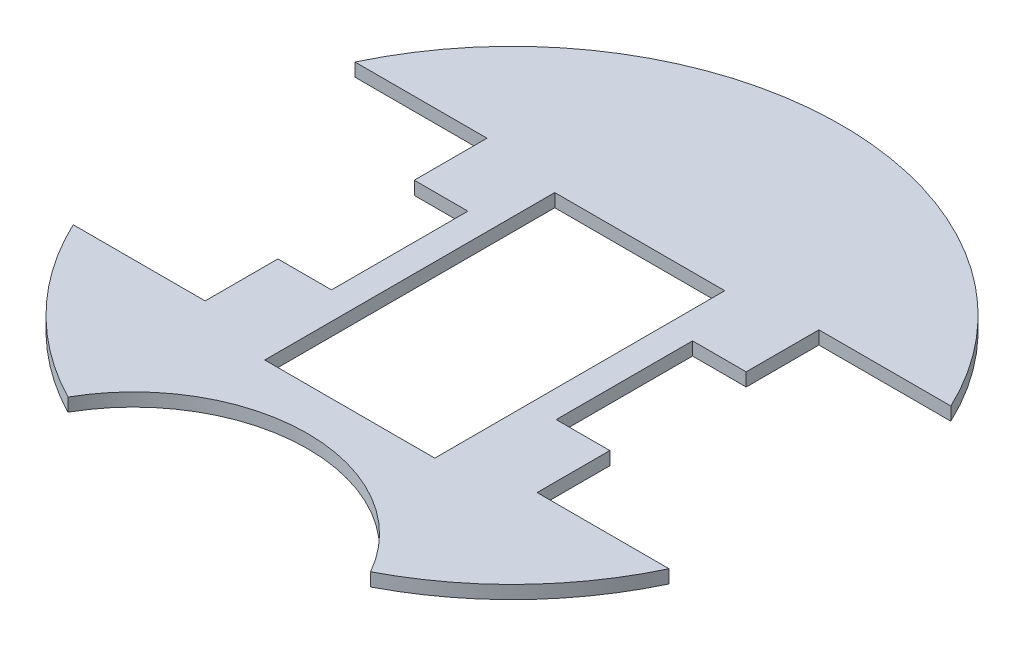
ISO-10303-21;
HEADER;
FILE_DESCRIPTION(('STEP AP214'),'2;1');
FILE_NAME('part.step','',(''),(''),'','','');
FILE_SCHEMA(('AUTOMOTIVE_DESIGN { 1 0 10303 214 1 1 1 1 }'));
ENDSEC;
DATA;
#1=APPLICATION_CONTEXT('core data for automotive mechanical design processes');
#2=APPLICATION_PROTOCOL_DEFINITION('international standard','automotive_design',2000,#1);
#3=PRODUCT_CONTEXT('',#1,'mechanical');
#4=PRODUCT('Part','Part','',(#3));
#5=PRODUCT_RELATED_PRODUCT_CATEGORY('part','',(#4));
#6=PRODUCT_DEFINITION_FORMATION('','',#4);
#7=PRODUCT_DEFINITION_CONTEXT('part definition',#1,'design');
#8=PRODUCT_DEFINITION('design','',#6,#7);
#9=PRODUCT_DEFINITION_SHAPE('','',#8);
#10=(LENGTH_UNIT() NAMED_UNIT(*) SI_UNIT(.MILLI.,.METRE.));
#11=(NAMED_UNIT(*) PLANE_ANGLE_UNIT() SI_UNIT($,.RADIAN.));
#12=(NAMED_UNIT(*) SI_UNIT($,.STERADIAN.) SOLID_ANGLE_UNIT());
#13=UNCERTAINTY_MEASURE_WITH_UNIT(LENGTH_MEASURE(1.E-05),#10,'distance_accuracy_value','');
#14=(GEOMETRIC_REPRESENTATION_CONTEXT(3) GLOBAL_UNCERTAINTY_ASSIGNED_CONTEXT((#13)) GLOBAL_UNIT_ASSIGNED_CONTEXT((#10,
#11,#12)) REPRESENTATION_CONTEXT('',''));
#15=CARTESIAN_POINT('',(0.,0.,0.));
#16=DIRECTION('',(0.,0.,1.));
#17=DIRECTION('',(1.,0.,0.));
#18=AXIS2_PLACEMENT_3D('',#15,#16,#17);
#19=CARTESIAN_POINT('',(0.,2.9,0.));
#20=DIRECTION('',(0.,-1.,0.));
#21=DIRECTION('',(0.,0.,-1.));
#22=AXIS2_PLACEMENT_3D('',#19,#20,#21);
#23=CYLINDRICAL_SURFACE('',#22,72.5);
#24=CARTESIAN_POINT('',(0.,0.,0.));
#25=DIRECTION('',(0.,1.,0.));
#26=DIRECTION('',(0.,0.,1.));
#27=AXIS2_PLACEMENT_3D('',#24,#25,#26);
#28=CIRCLE('',#27,72.5);
#29=CARTESIAN_POINT('',(33.2911053697012,0.,64.4045984636458));
#30=VERTEX_POINT('',#29);
#31=CARTESIAN_POINT('',(65.5381568248604,0.,31.));
#32=VERTEX_POINT('',#31);
#33=EDGE_CURVE('E207',#30,#32,#28,.T.);
#34=ORIENTED_EDGE('',*,*,#33,.T.);
#35=DIRECTION('',(0.,1.,0.));
#36=VECTOR('',#35,1.);
#37=CARTESIAN_POINT('',(65.5381568248604,0.,31.));
#38=LINE('',#37,#36);
#39=CARTESIAN_POINT('',(65.5381568248604,2.9,31.));
#40=VERTEX_POINT('',#39);
#41=EDGE_CURVE('E303',#32,#40,#38,.T.);
#42=ORIENTED_EDGE('',*,*,#41,.T.);
#43=CARTESIAN_POINT('',(0.,2.9,0.));
#44=DIRECTION('',(0.,1.,0.));
#45=DIRECTION('',(0.,0.,1.));
#46=AXIS2_PLACEMENT_3D('',#43,#44,#45);
#47=CIRCLE('',#46,72.5);
#48=CARTESIAN_POINT('',(33.2911053697012,2.9,64.4045984636458));
#49=VERTEX_POINT('',#48);
#50=EDGE_CURVE('E216',#49,#40,#47,.T.);
#51=ORIENTED_EDGE('',*,*,#50,.F.);
#52=DIRECTION('',(0.,-1.,0.));
#53=VECTOR('',#52,1.);
#54=CARTESIAN_POINT('',(33.2911053697012,2.9,64.4045984636458));
#55=LINE('',#54,#53);
#56=EDGE_CURVE('E11',#49,#30,#55,.T.);
#57=ORIENTED_EDGE('',*,*,#56,.T.);
#58=EDGE_LOOP('',(#34,#42,#51,#57));
#59=FACE_BOUND('',#58,.T.);
#60=ADVANCED_FACE('F32',(#59),#23,.T.);
#61=CARTESIAN_POINT('',(-65.5381568248605,2.9,30.9999999999999));
#62=VERTEX_POINT('',#61);
#63=CARTESIAN_POINT('',(-33.2911053697012,2.9,64.4045984636458));
#64=VERTEX_POINT('',#63);
#65=EDGE_CURVE('E223',#62,#64,#47,.T.);
#66=ORIENTED_EDGE('',*,*,#65,.F.);
#67=DIRECTION('',(0.,1.,0.));
#68=VECTOR('',#67,1.);
#69=CARTESIAN_POINT('',(-65.5381568248605,0.,30.9999999999999));
#70=LINE('',#69,#68);
#71=CARTESIAN_POINT('',(-65.5381568248605,0.,30.9999999999999));
#72=VERTEX_POINT('',#71);
#73=EDGE_CURVE('E278',#72,#62,#70,.T.);
#74=ORIENTED_EDGE('',*,*,#73,.F.);
#75=CARTESIAN_POINT('',(-33.2911053697012,0.,64.4045984636458));
#76=VERTEX_POINT('',#75);
#77=EDGE_CURVE('E208',#72,#76,#28,.T.);
#78=ORIENTED_EDGE('',*,*,#77,.T.);
#79=DIRECTION('',(0.,-1.,0.));
#80=VECTOR('',#79,1.);
#81=CARTESIAN_POINT('',(-33.2911053697012,2.9,64.4045984636458));
#82=LINE('',#81,#80);
#83=EDGE_CURVE('E40',#64,#76,#82,.T.);
#84=ORIENTED_EDGE('',*,*,#83,.F.);
#85=EDGE_LOOP('',(#66,#74,#78,#84));
#86=FACE_BOUND('',#85,.T.);
#87=ADVANCED_FACE('F384',(#86),#23,.T.);
#88=CARTESIAN_POINT('',(0.,2.9,83.2397996376034));
#89=DIRECTION('',(0.,-1.,0.));
#90=DIRECTION('',(0.,0.,-1.));
#91=AXIS2_PLACEMENT_3D('',#88,#89,#90);
#92=CYLINDRICAL_SURFACE('',#91,38.25);
#93=CARTESIAN_POINT('',(0.,0.,83.2397996376034));
#94=DIRECTION('',(0.,-1.,0.));
#95=DIRECTION('',(0.,0.,1.));
#96=AXIS2_PLACEMENT_3D('',#93,#94,#95);
#97=CIRCLE('',#96,38.25);
#98=EDGE_CURVE('E212',#76,#30,#97,.T.);
#99=ORIENTED_EDGE('',*,*,#98,.T.);
#100=ORIENTED_EDGE('',*,*,#56,.F.);
#101=CARTESIAN_POINT('',(0.,2.9,83.2397996376034));
#102=DIRECTION('',(0.,-1.,0.));
#103=DIRECTION('',(0.,0.,1.));
#104=AXIS2_PLACEMENT_3D('',#101,#102,#103);
#105=CIRCLE('',#104,38.25);
#106=EDGE_CURVE('E211',#64,#49,#105,.T.);
#107=ORIENTED_EDGE('',*,*,#106,.F.);
#108=ORIENTED_EDGE('',*,*,#83,.T.);
#109=EDGE_LOOP('',(#99,#100,#107,#108));
#110=FACE_BOUND('',#109,.T.);
#111=ADVANCED_FACE('F34',(#110),#92,.F.);
#112=CARTESIAN_POINT('',(65.5381568248604,2.9,-31.));
#113=VERTEX_POINT('',#112);
#114=CARTESIAN_POINT('',(-65.5381568248604,2.9,-31.));
#115=VERTEX_POINT('',#114);
#116=EDGE_CURVE('E197',#113,#115,#47,.T.);
#117=ORIENTED_EDGE('',*,*,#116,.F.);
#118=DIRECTION('',(0.,1.,0.));
#119=VECTOR('',#118,1.);
#120=CARTESIAN_POINT('',(65.5381568248604,0.,-31.));
#121=LINE('',#120,#119);
#122=CARTESIAN_POINT('',(65.5381568248604,0.,-31.));
#123=VERTEX_POINT('',#122);
#124=EDGE_CURVE('E184',#123,#113,#121,.T.);
#125=ORIENTED_EDGE('',*,*,#124,.F.);
#126=CARTESIAN_POINT('',(-65.5381568248604,0.,-31.));
#127=VERTEX_POINT('',#126);
#128=EDGE_CURVE('E195',#123,#127,#28,.T.);
#129=ORIENTED_EDGE('',*,*,#128,.T.);
#130=DIRECTION('',(0.,1.,0.));
#131=VECTOR('',#130,1.);
#132=CARTESIAN_POINT('',(-65.5381568248604,0.,-31.));
#133=LINE('',#132,#131);
#134=EDGE_CURVE('E276',#127,#115,#133,.T.);
#135=ORIENTED_EDGE('',*,*,#134,.T.);
#136=EDGE_LOOP('',(#117,#125,#129,#135));
#137=FACE_BOUND('',#136,.T.);
#138=ADVANCED_FACE('F193',(#137),#23,.T.);
#139=CARTESIAN_POINT('',(0.,2.9,41.6198998188017));
#140=DIRECTION('',(0.,1.,0.));
#141=DIRECTION('',(0.,0.,1.));
#142=AXIS2_PLACEMENT_3D('',#139,#140,#141);
#143=PLANE('',#142);
#144=DIRECTION('',(1.,0.,0.));
#145=VECTOR('',#144,1.);
#146=CARTESIAN_POINT('',(36.5100000000001,2.9,31.));
#147=LINE('',#146,#145);
#148=CARTESIAN_POINT('',(36.5100000000001,2.9,31.));
#149=VERTEX_POINT('',#148);
#150=EDGE_CURVE('E189',#149,#40,#147,.T.);
#151=ORIENTED_EDGE('',*,*,#150,.F.);
#152=DIRECTION('',(0.,0.,1.));
#153=VECTOR('',#152,1.);
#154=CARTESIAN_POINT('',(36.5100000000001,2.9,14.9999999999999));
#155=LINE('',#154,#153);
#156=CARTESIAN_POINT('',(36.5100000000001,2.9,14.9999999999999));
#157=VERTEX_POINT('',#156);
#158=EDGE_CURVE('E332',#157,#149,#155,.T.);
#159=ORIENTED_EDGE('',*,*,#158,.F.);
#160=DIRECTION('',(1.,0.,0.));
#161=VECTOR('',#160,1.);
#162=CARTESIAN_POINT('',(36.5100000000001,2.9,14.9999999999999));
#163=LINE('',#162,#161);
#164=CARTESIAN_POINT('',(24.7100000000001,2.9,14.9999999999999));
#165=VERTEX_POINT('',#164);
#166=EDGE_CURVE('E335',#165,#157,#163,.T.);
#167=ORIENTED_EDGE('',*,*,#166,.F.);
#168=DIRECTION('',(0.,0.,1.));
#169=VECTOR('',#168,1.);
#170=CARTESIAN_POINT('',(24.7100000000001,2.9,14.9999999999999));
#171=LINE('',#170,#169);
#172=CARTESIAN_POINT('',(24.7100000000001,2.9,-15.));
#173=VERTEX_POINT('',#172);
#174=EDGE_CURVE('E338',#173,#165,#171,.T.);
#175=ORIENTED_EDGE('',*,*,#174,.F.);
#176=DIRECTION('',(-1.,0.,0.));
#177=VECTOR('',#176,1.);
#178=CARTESIAN_POINT('',(36.5100000000001,2.9,-15.));
#179=LINE('',#178,#177);
#180=CARTESIAN_POINT('',(36.5100000000001,2.9,-15.));
#181=VERTEX_POINT('',#180);
#182=EDGE_CURVE('E341',#181,#173,#179,.T.);
#183=ORIENTED_EDGE('',*,*,#182,.F.);
#184=DIRECTION('',(0.,0.,1.));
#185=VECTOR('',#184,1.);
#186=CARTESIAN_POINT('',(36.5100000000001,2.9,-15.));
#187=LINE('',#186,#185);
#188=CARTESIAN_POINT('',(36.5100000000001,2.9,-31.));
#189=VERTEX_POINT('',#188);
#190=EDGE_CURVE('E344',#189,#181,#187,.T.);
#191=ORIENTED_EDGE('',*,*,#190,.F.);
#192=DIRECTION('',(-1.,0.,0.));
#193=VECTOR('',#192,1.);
#194=CARTESIAN_POINT('',(36.5100000000001,2.9,-31.));
#195=LINE('',#194,#193);
#196=EDGE_CURVE('E347',#113,#189,#195,.T.);
#197=ORIENTED_EDGE('',*,*,#196,.F.);
#198=ORIENTED_EDGE('',*,*,#116,.T.);
#199=DIRECTION('',(-1.,0.,0.));
#200=VECTOR('',#199,1.);
#201=CARTESIAN_POINT('',(-36.5100000000001,2.9,-31.));
#202=LINE('',#201,#200);
#203=CARTESIAN_POINT('',(-36.5100000000001,2.9,-31.));
#204=VERTEX_POINT('',#203);
#205=EDGE_CURVE('E285',#204,#115,#202,.T.);
#206=ORIENTED_EDGE('',*,*,#205,.F.);
#207=DIRECTION('',(0.,0.,-1.));
#208=VECTOR('',#207,1.);
#209=CARTESIAN_POINT('',(-36.5100000000001,2.9,-15.));
#210=LINE('',#209,#208);
#211=CARTESIAN_POINT('',(-36.5100000000001,2.9,-15.));
#212=VERTEX_POINT('',#211);
#213=EDGE_CURVE('E288',#212,#204,#210,.T.);
#214=ORIENTED_EDGE('',*,*,#213,.F.);
#215=DIRECTION('',(-1.,0.,0.));
#216=VECTOR('',#215,1.);
#217=CARTESIAN_POINT('',(-36.5100000000001,2.9,-15.));
#218=LINE('',#217,#216);
#219=CARTESIAN_POINT('',(-24.7100000000001,2.9,-15.));
#220=VERTEX_POINT('',#219);
#221=EDGE_CURVE('E291',#220,#212,#218,.T.);
#222=ORIENTED_EDGE('',*,*,#221,.F.);
#223=DIRECTION('',(0.,0.,-1.));
#224=VECTOR('',#223,1.);
#225=CARTESIAN_POINT('',(-24.7100000000001,2.9,14.9999999999999));
#226=LINE('',#225,#224);
#227=CARTESIAN_POINT('',(-24.7100000000001,2.9,14.9999999999999));
#228=VERTEX_POINT('',#227);
#229=EDGE_CURVE('E294',#228,#220,#226,.T.);
#230=ORIENTED_EDGE('',*,*,#229,.F.);
#231=DIRECTION('',(1.,0.,0.));
#232=VECTOR('',#231,1.);
#233=CARTESIAN_POINT('',(-36.5100000000001,2.9,14.9999999999999));
#234=LINE('',#233,#232);
#235=CARTESIAN_POINT('',(-36.5100000000001,2.9,14.9999999999999));
#236=VERTEX_POINT('',#235);
#237=EDGE_CURVE('E297',#236,#228,#234,.T.);
#238=ORIENTED_EDGE('',*,*,#237,.F.);
#239=DIRECTION('',(0.,0.,-1.));
#240=VECTOR('',#239,1.);
#241=CARTESIAN_POINT('',(-36.5100000000001,2.9,14.9999999999999));
#242=LINE('',#241,#240);
#243=CARTESIAN_POINT('',(-36.5100000000001,2.9,31.));
#244=VERTEX_POINT('',#243);
#245=EDGE_CURVE('E300',#244,#236,#242,.T.);
#246=ORIENTED_EDGE('',*,*,#245,.F.);
#247=DIRECTION('',(1.,0.,0.));
#248=VECTOR('',#247,1.);
#249=CARTESIAN_POINT('',(-36.5100000000001,2.9,31.));
#250=LINE('',#249,#248);
#251=EDGE_CURVE('E281',#62,#244,#250,.T.);
#252=ORIENTED_EDGE('',*,*,#251,.F.);
#253=ORIENTED_EDGE('',*,*,#65,.T.);
#254=ORIENTED_EDGE('',*,*,#106,.T.);
#255=ORIENTED_EDGE('',*,*,#50,.T.);
#256=EDGE_LOOP('',(#151,#159,#167,#175,#183,#191,#197,#198,#206,#214,#222,#230,#238,#246,#252,
#253,#254,#255));
#257=FACE_BOUND('',#256,.T.);
#258=DIRECTION('',(0.,0.,1.));
#259=VECTOR('',#258,1.);
#260=CARTESIAN_POINT('',(-18.7,2.9,-28.1));
#261=LINE('',#260,#259);
#262=CARTESIAN_POINT('',(-18.7,2.9,-28.1));
#263=VERTEX_POINT('',#262);
#264=CARTESIAN_POINT('',(-18.7,2.9,35.7));
#265=VERTEX_POINT('',#264);
#266=EDGE_CURVE('E252',#263,#265,#261,.T.);
#267=ORIENTED_EDGE('',*,*,#266,.F.);
#268=DIRECTION('',(-1.,0.,0.));
#269=VECTOR('',#268,1.);
#270=CARTESIAN_POINT('',(18.7,2.9,-28.1));
#271=LINE('',#270,#269);
#272=CARTESIAN_POINT('',(18.7,2.9,-28.1));
#273=VERTEX_POINT('',#272);
#274=EDGE_CURVE('E242',#273,#263,#271,.T.);
#275=ORIENTED_EDGE('',*,*,#274,.F.);
#276=DIRECTION('',(0.,0.,-1.));
#277=VECTOR('',#276,1.);
#278=CARTESIAN_POINT('',(18.7,2.9,35.7));
#279=LINE('',#278,#277);
#280=CARTESIAN_POINT('',(18.7,2.9,35.7));
#281=VERTEX_POINT('',#280);
#282=EDGE_CURVE('E246',#281,#273,#279,.T.);
#283=ORIENTED_EDGE('',*,*,#282,.F.);
#284=DIRECTION('',(1.,0.,0.));
#285=VECTOR('',#284,1.);
#286=CARTESIAN_POINT('',(-18.7,2.9,35.7));
#287=LINE('',#286,#285);
#288=EDGE_CURVE('E249',#265,#281,#287,.T.);
#289=ORIENTED_EDGE('',*,*,#288,.F.);
#290=EDGE_LOOP('',(#267,#275,#283,#289));
#291=FACE_BOUND('',#290,.T.);
#292=ADVANCED_FACE('F389',(#257,#291),#143,.T.);
#293=CARTESIAN_POINT('',(0.,0.,41.6198998188017));
#294=DIRECTION('',(0.,1.,0.));
#295=DIRECTION('',(0.,0.,1.));
#296=AXIS2_PLACEMENT_3D('',#293,#294,#295);
#297=PLANE('',#296);
#298=DIRECTION('',(0.,0.,1.));
#299=VECTOR('',#298,1.);
#300=CARTESIAN_POINT('',(36.5100000000001,0.,14.9999999999999));
#301=LINE('',#300,#299);
#302=CARTESIAN_POINT('',(36.5100000000001,0.,14.9999999999999));
#303=VERTEX_POINT('',#302);
#304=CARTESIAN_POINT('',(36.5100000000001,0.,31.));
#305=VERTEX_POINT('',#304);
#306=EDGE_CURVE('E351',#303,#305,#301,.T.);
#307=ORIENTED_EDGE('',*,*,#306,.T.);
#308=DIRECTION('',(1.,0.,0.));
#309=VECTOR('',#308,1.);
#310=CARTESIAN_POINT('',(36.5100000000001,0.,31.));
#311=LINE('',#310,#309);
#312=EDGE_CURVE('E198',#305,#32,#311,.T.);
#313=ORIENTED_EDGE('',*,*,#312,.T.);
#314=ORIENTED_EDGE('',*,*,#33,.F.);
#315=ORIENTED_EDGE('',*,*,#98,.F.);
#316=ORIENTED_EDGE('',*,*,#77,.F.);
#317=DIRECTION('',(1.,0.,0.));
#318=VECTOR('',#317,1.);
#319=CARTESIAN_POINT('',(-36.5100000000001,0.,31.));
#320=LINE('',#319,#318);
#321=CARTESIAN_POINT('',(-36.5100000000001,0.,31.));
#322=VERTEX_POINT('',#321);
#323=EDGE_CURVE('E268',#72,#322,#320,.T.);
#324=ORIENTED_EDGE('',*,*,#323,.T.);
#325=DIRECTION('',(0.,0.,-1.));
#326=VECTOR('',#325,1.);
#327=CARTESIAN_POINT('',(-36.5100000000001,0.,14.9999999999999));
#328=LINE('',#327,#326);
#329=CARTESIAN_POINT('',(-36.5100000000001,0.,14.9999999999999));
#330=VERTEX_POINT('',#329);
#331=EDGE_CURVE('E284',#322,#330,#328,.T.);
#332=ORIENTED_EDGE('',*,*,#331,.T.);
#333=DIRECTION('',(1.,0.,0.));
#334=VECTOR('',#333,1.);
#335=CARTESIAN_POINT('',(-36.5100000000001,0.,14.9999999999999));
#336=LINE('',#335,#334);
#337=CARTESIAN_POINT('',(-24.7100000000001,0.,14.9999999999999));
#338=VERTEX_POINT('',#337);
#339=EDGE_CURVE('E313',#330,#338,#336,.T.);
#340=ORIENTED_EDGE('',*,*,#339,.T.);
#341=DIRECTION('',(0.,0.,-1.));
#342=VECTOR('',#341,1.);
#343=CARTESIAN_POINT('',(-24.7100000000001,0.,14.9999999999999));
#344=LINE('',#343,#342);
#345=CARTESIAN_POINT('',(-24.7100000000001,0.,-15.));
#346=VERTEX_POINT('',#345);
#347=EDGE_CURVE('E55',#338,#346,#344,.T.);
#348=ORIENTED_EDGE('',*,*,#347,.T.);
#349=DIRECTION('',(-1.,0.,0.));
#350=VECTOR('',#349,1.);
#351=CARTESIAN_POINT('',(-36.5100000000001,0.,-15.));
#352=LINE('',#351,#350);
#353=CARTESIAN_POINT('',(-36.5100000000001,0.,-15.));
#354=VERTEX_POINT('',#353);
#355=EDGE_CURVE('E309',#346,#354,#352,.T.);
#356=ORIENTED_EDGE('',*,*,#355,.T.);
#357=DIRECTION('',(0.,0.,-1.));
#358=VECTOR('',#357,1.);
#359=CARTESIAN_POINT('',(-36.5100000000001,0.,-15.));
#360=LINE('',#359,#358);
#361=CARTESIAN_POINT('',(-36.5100000000001,0.,-31.));
#362=VERTEX_POINT('',#361);
#363=EDGE_CURVE('E307',#354,#362,#360,.T.);
#364=ORIENTED_EDGE('',*,*,#363,.T.);
#365=DIRECTION('',(-1.,0.,0.));
#366=VECTOR('',#365,1.);
#367=CARTESIAN_POINT('',(-36.5100000000001,0.,-31.));
#368=LINE('',#367,#366);
#369=EDGE_CURVE('E206',#362,#127,#368,.T.);
#370=ORIENTED_EDGE('',*,*,#369,.T.);
#371=ORIENTED_EDGE('',*,*,#128,.F.);
#372=DIRECTION('',(-1.,0.,0.));
#373=VECTOR('',#372,1.);
#374=CARTESIAN_POINT('',(36.5100000000001,0.,-31.));
#375=LINE('',#374,#373);
#376=CARTESIAN_POINT('',(36.5100000000001,0.,-31.));
#377=VERTEX_POINT('',#376);
#378=EDGE_CURVE('E180',#123,#377,#375,.T.);
#379=ORIENTED_EDGE('',*,*,#378,.T.);
#380=DIRECTION('',(0.,0.,1.));
#381=VECTOR('',#380,1.);
#382=CARTESIAN_POINT('',(36.5100000000001,0.,-15.));
#383=LINE('',#382,#381);
#384=CARTESIAN_POINT('',(36.5100000000001,0.,-15.));
#385=VERTEX_POINT('',#384);
#386=EDGE_CURVE('E47',#377,#385,#383,.T.);
#387=ORIENTED_EDGE('',*,*,#386,.T.);
#388=DIRECTION('',(-1.,0.,0.));
#389=VECTOR('',#388,1.);
#390=CARTESIAN_POINT('',(36.5100000000001,0.,-15.));
#391=LINE('',#390,#389);
#392=CARTESIAN_POINT('',(24.7100000000001,0.,-15.));
#393=VERTEX_POINT('',#392);
#394=EDGE_CURVE('E359',#385,#393,#391,.T.);
#395=ORIENTED_EDGE('',*,*,#394,.T.);
#396=DIRECTION('',(0.,0.,1.));
#397=VECTOR('',#396,1.);
#398=CARTESIAN_POINT('',(24.7100000000001,0.,14.9999999999999));
#399=LINE('',#398,#397);
#400=CARTESIAN_POINT('',(24.7100000000001,0.,14.9999999999999));
#401=VERTEX_POINT('',#400);
#402=EDGE_CURVE('E356',#393,#401,#399,.T.);
#403=ORIENTED_EDGE('',*,*,#402,.T.);
#404=DIRECTION('',(1.,0.,0.));
#405=VECTOR('',#404,1.);
#406=CARTESIAN_POINT('',(36.5100000000001,0.,14.9999999999999));
#407=LINE('',#406,#405);
#408=EDGE_CURVE('E353',#401,#303,#407,.T.);
#409=ORIENTED_EDGE('',*,*,#408,.T.);
#410=EDGE_LOOP('',(#307,#313,#314,#315,#316,#324,#332,#340,#348,#356,#364,#370,#371,#379,#387,
#395,#403,#409));
#411=FACE_BOUND('',#410,.T.);
#412=DIRECTION('',(-1.,0.,0.));
#413=VECTOR('',#412,1.);
#414=CARTESIAN_POINT('',(18.7,0.,-28.1));
#415=LINE('',#414,#413);
#416=CARTESIAN_POINT('',(18.7,0.,-28.1));
#417=VERTEX_POINT('',#416);
#418=CARTESIAN_POINT('',(-18.7,0.,-28.1));
#419=VERTEX_POINT('',#418);
#420=EDGE_CURVE('E236',#417,#419,#415,.T.);
#421=ORIENTED_EDGE('',*,*,#420,.T.);
#422=DIRECTION('',(0.,0.,1.));
#423=VECTOR('',#422,1.);
#424=CARTESIAN_POINT('',(-18.7,0.,-28.1));
#425=LINE('',#424,#423);
#426=CARTESIAN_POINT('',(-18.7,0.,35.7));
#427=VERTEX_POINT('',#426);
#428=EDGE_CURVE('E245',#419,#427,#425,.T.);
#429=ORIENTED_EDGE('',*,*,#428,.T.);
#430=DIRECTION('',(1.,0.,0.));
#431=VECTOR('',#430,1.);
#432=CARTESIAN_POINT('',(-18.7,0.,35.7));
#433=LINE('',#432,#431);
#434=CARTESIAN_POINT('',(18.7,0.,35.7));
#435=VERTEX_POINT('',#434);
#436=EDGE_CURVE('E260',#427,#435,#433,.T.);
#437=ORIENTED_EDGE('',*,*,#436,.T.);
#438=DIRECTION('',(0.,0.,-1.));
#439=VECTOR('',#438,1.);
#440=CARTESIAN_POINT('',(18.7,0.,35.7));
#441=LINE('',#440,#439);
#442=EDGE_CURVE('E257',#435,#417,#441,.T.);
#443=ORIENTED_EDGE('',*,*,#442,.T.);
#444=EDGE_LOOP('',(#421,#429,#437,#443));
#445=FACE_BOUND('',#444,.T.);
#446=ADVANCED_FACE('F202',(#411,#445),#297,.F.);
#447=CARTESIAN_POINT('',(-18.7,0.,-28.1));
#448=DIRECTION('',(-1.,0.,0.));
#449=DIRECTION('',(0.,0.,1.));
#450=AXIS2_PLACEMENT_3D('',#447,#448,#449);
#451=PLANE('',#450);
#452=ORIENTED_EDGE('',*,*,#266,.T.);
#453=DIRECTION('',(0.,1.,0.));
#454=VECTOR('',#453,1.);
#455=CARTESIAN_POINT('',(-18.7,0.,35.7));
#456=LINE('',#455,#454);
#457=EDGE_CURVE('E232',#427,#265,#456,.T.);
#458=ORIENTED_EDGE('',*,*,#457,.F.);
#459=ORIENTED_EDGE('',*,*,#428,.F.);
#460=DIRECTION('',(0.,1.,0.));
#461=VECTOR('',#460,1.);
#462=CARTESIAN_POINT('',(-18.7,0.,-28.1));
#463=LINE('',#462,#461);
#464=EDGE_CURVE('E240',#419,#263,#463,.T.);
#465=ORIENTED_EDGE('',*,*,#464,.T.);
#466=EDGE_LOOP('',(#452,#458,#459,#465));
#467=FACE_BOUND('',#466,.T.);
#468=ADVANCED_FACE('F397',(#467),#451,.F.);
#469=CARTESIAN_POINT('',(18.7,0.,-28.1));
#470=DIRECTION('',(0.,0.,-1.));
#471=DIRECTION('',(-1.,0.,0.));
#472=AXIS2_PLACEMENT_3D('',#469,#470,#471);
#473=PLANE('',#472);
#474=ORIENTED_EDGE('',*,*,#274,.T.);
#475=ORIENTED_EDGE('',*,*,#464,.F.);
#476=ORIENTED_EDGE('',*,*,#420,.F.);
#477=DIRECTION('',(0.,1.,0.));
#478=VECTOR('',#477,1.);
#479=CARTESIAN_POINT('',(18.7,0.,-28.1));
#480=LINE('',#479,#478);
#481=EDGE_CURVE('E238',#417,#273,#480,.T.);
#482=ORIENTED_EDGE('',*,*,#481,.T.);
#483=EDGE_LOOP('',(#474,#475,#476,#482));
#484=FACE_BOUND('',#483,.T.);
#485=ADVANCED_FACE('F402',(#484),#473,.F.);
#486=CARTESIAN_POINT('',(18.7,0.,35.7));
#487=DIRECTION('',(1.,0.,0.));
#488=DIRECTION('',(0.,0.,-1.));
#489=AXIS2_PLACEMENT_3D('',#486,#487,#488);
#490=PLANE('',#489);
#491=ORIENTED_EDGE('',*,*,#282,.T.);
#492=ORIENTED_EDGE('',*,*,#481,.F.);
#493=ORIENTED_EDGE('',*,*,#442,.F.);
#494=DIRECTION('',(0.,1.,0.));
#495=VECTOR('',#494,1.);
#496=CARTESIAN_POINT('',(18.7,0.,35.7));
#497=LINE('',#496,#495);
#498=EDGE_CURVE('E235',#435,#281,#497,.T.);
#499=ORIENTED_EDGE('',*,*,#498,.T.);
#500=EDGE_LOOP('',(#491,#492,#493,#499));
#501=FACE_BOUND('',#500,.T.);
#502=ADVANCED_FACE('F408',(#501),#490,.F.);
#503=CARTESIAN_POINT('',(-18.7,0.,35.7));
#504=DIRECTION('',(0.,0.,1.));
#505=DIRECTION('',(1.,0.,0.));
#506=AXIS2_PLACEMENT_3D('',#503,#504,#505);
#507=PLANE('',#506);
#508=ORIENTED_EDGE('',*,*,#288,.T.);
#509=ORIENTED_EDGE('',*,*,#498,.F.);
#510=ORIENTED_EDGE('',*,*,#436,.F.);
#511=ORIENTED_EDGE('',*,*,#457,.T.);
#512=EDGE_LOOP('',(#508,#509,#510,#511));
#513=FACE_BOUND('',#512,.T.);
#514=ADVANCED_FACE('F404',(#513),#507,.F.);
#515=CARTESIAN_POINT('',(-36.5100000000001,0.,14.9999999999999));
#516=DIRECTION('',(1.,0.,0.));
#517=DIRECTION('',(0.,0.,-1.));
#518=AXIS2_PLACEMENT_3D('',#515,#516,#517);
#519=PLANE('',#518);
#520=ORIENTED_EDGE('',*,*,#245,.T.);
#521=DIRECTION('',(0.,1.,0.));
#522=VECTOR('',#521,1.);
#523=CARTESIAN_POINT('',(-36.5100000000001,0.,14.9999999999999));
#524=LINE('',#523,#522);
#525=EDGE_CURVE('E265',#330,#236,#524,.T.);
#526=ORIENTED_EDGE('',*,*,#525,.F.);
#527=ORIENTED_EDGE('',*,*,#331,.F.);
#528=DIRECTION('',(0.,1.,0.));
#529=VECTOR('',#528,1.);
#530=CARTESIAN_POINT('',(-36.5100000000001,0.,31.));
#531=LINE('',#530,#529);
#532=EDGE_CURVE('E254',#322,#244,#531,.T.);
#533=ORIENTED_EDGE('',*,*,#532,.T.);
#534=EDGE_LOOP('',(#520,#526,#527,#533));
#535=FACE_BOUND('',#534,.T.);
#536=ADVANCED_FACE('F407',(#535),#519,.F.);
#537=CARTESIAN_POINT('',(-36.5100000000001,0.,31.));
#538=DIRECTION('',(0.,0.,1.));
#539=DIRECTION('',(1.,0.,0.));
#540=AXIS2_PLACEMENT_3D('',#537,#538,#539);
#541=PLANE('',#540);
#542=ORIENTED_EDGE('',*,*,#251,.T.);
#543=ORIENTED_EDGE('',*,*,#532,.F.);
#544=ORIENTED_EDGE('',*,*,#323,.F.);
#545=ORIENTED_EDGE('',*,*,#73,.T.);
#546=EDGE_LOOP('',(#542,#543,#544,#545));
#547=FACE_BOUND('',#546,.T.);
#548=ADVANCED_FACE('F418',(#547),#541,.F.);
#549=CARTESIAN_POINT('',(-36.5100000000001,0.,-31.));
#550=DIRECTION('',(0.,0.,-1.));
#551=DIRECTION('',(-1.,0.,0.));
#552=AXIS2_PLACEMENT_3D('',#549,#550,#551);
#553=PLANE('',#552);
#554=ORIENTED_EDGE('',*,*,#205,.T.);
#555=ORIENTED_EDGE('',*,*,#134,.F.);
#556=ORIENTED_EDGE('',*,*,#369,.F.);
#557=DIRECTION('',(0.,1.,0.));
#558=VECTOR('',#557,1.);
#559=CARTESIAN_POINT('',(-36.5100000000001,0.,-31.));
#560=LINE('',#559,#558);
#561=EDGE_CURVE('E274',#362,#204,#560,.T.);
#562=ORIENTED_EDGE('',*,*,#561,.T.);
#563=EDGE_LOOP('',(#554,#555,#556,#562));
#564=FACE_BOUND('',#563,.T.);
#565=ADVANCED_FACE('F434',(#564),#553,.F.);
#566=CARTESIAN_POINT('',(-36.5100000000001,0.,-15.));
#567=DIRECTION('',(1.,0.,0.));
#568=DIRECTION('',(0.,0.,-1.));
#569=AXIS2_PLACEMENT_3D('',#566,#567,#568);
#570=PLANE('',#569);
#571=ORIENTED_EDGE('',*,*,#213,.T.);
#572=ORIENTED_EDGE('',*,*,#561,.F.);
#573=ORIENTED_EDGE('',*,*,#363,.F.);
#574=DIRECTION('',(0.,1.,0.));
#575=VECTOR('',#574,1.);
#576=CARTESIAN_POINT('',(-36.5100000000001,0.,-15.));
#577=LINE('',#576,#575);
#578=EDGE_CURVE('E272',#354,#212,#577,.T.);
#579=ORIENTED_EDGE('',*,*,#578,.T.);
#580=EDGE_LOOP('',(#571,#572,#573,#579));
#581=FACE_BOUND('',#580,.T.);
#582=ADVANCED_FACE('F430',(#581),#570,.F.);
#583=CARTESIAN_POINT('',(-36.5100000000001,0.,-15.));
#584=DIRECTION('',(0.,0.,-1.));
#585=DIRECTION('',(-1.,0.,0.));
#586=AXIS2_PLACEMENT_3D('',#583,#584,#585);
#587=PLANE('',#586);
#588=ORIENTED_EDGE('',*,*,#221,.T.);
#589=ORIENTED_EDGE('',*,*,#578,.F.);
#590=ORIENTED_EDGE('',*,*,#355,.F.);
#591=DIRECTION('',(0.,1.,0.));
#592=VECTOR('',#591,1.);
#593=CARTESIAN_POINT('',(-24.7100000000001,0.,-15.));
#594=LINE('',#593,#592);
#595=EDGE_CURVE('E270',#346,#220,#594,.T.);
#596=ORIENTED_EDGE('',*,*,#595,.T.);
#597=EDGE_LOOP('',(#588,#589,#590,#596));
#598=FACE_BOUND('',#597,.T.);
#599=ADVANCED_FACE('F427',(#598),#587,.F.);
#600=CARTESIAN_POINT('',(-24.7100000000001,0.,14.9999999999999));
#601=DIRECTION('',(1.,0.,0.));
#602=DIRECTION('',(0.,0.,-1.));
#603=AXIS2_PLACEMENT_3D('',#600,#601,#602);
#604=PLANE('',#603);
#605=ORIENTED_EDGE('',*,*,#229,.T.);
#606=ORIENTED_EDGE('',*,*,#595,.F.);
#607=ORIENTED_EDGE('',*,*,#347,.F.);
#608=DIRECTION('',(0.,1.,0.));
#609=VECTOR('',#608,1.);
#610=CARTESIAN_POINT('',(-24.7100000000001,0.,14.9999999999999));
#611=LINE('',#610,#609);
#612=EDGE_CURVE('E267',#338,#228,#611,.T.);
#613=ORIENTED_EDGE('',*,*,#612,.T.);
#614=EDGE_LOOP('',(#605,#606,#607,#613));
#615=FACE_BOUND('',#614,.T.);
#616=ADVANCED_FACE('F423',(#615),#604,.F.);
#617=CARTESIAN_POINT('',(-36.5100000000001,0.,14.9999999999999));
#618=DIRECTION('',(0.,0.,1.));
#619=DIRECTION('',(1.,0.,0.));
#620=AXIS2_PLACEMENT_3D('',#617,#618,#619);
#621=PLANE('',#620);
#622=ORIENTED_EDGE('',*,*,#237,.T.);
#623=ORIENTED_EDGE('',*,*,#612,.F.);
#624=ORIENTED_EDGE('',*,*,#339,.F.);
#625=ORIENTED_EDGE('',*,*,#525,.T.);
#626=EDGE_LOOP('',(#622,#623,#624,#625));
#627=FACE_BOUND('',#626,.T.);
#628=ADVANCED_FACE('F420',(#627),#621,.F.);
#629=CARTESIAN_POINT('',(36.5100000000001,0.,31.));
#630=DIRECTION('',(0.,0.,1.));
#631=DIRECTION('',(1.,0.,0.));
#632=AXIS2_PLACEMENT_3D('',#629,#630,#631);
#633=PLANE('',#632);
#634=ORIENTED_EDGE('',*,*,#150,.T.);
#635=ORIENTED_EDGE('',*,*,#41,.F.);
#636=ORIENTED_EDGE('',*,*,#312,.F.);
#637=DIRECTION('',(0.,1.,0.));
#638=VECTOR('',#637,1.);
#639=CARTESIAN_POINT('',(36.5100000000001,0.,31.));
#640=LINE('',#639,#638);
#641=EDGE_CURVE('E327',#305,#149,#640,.T.);
#642=ORIENTED_EDGE('',*,*,#641,.T.);
#643=EDGE_LOOP('',(#634,#635,#636,#642));
#644=FACE_BOUND('',#643,.T.);
#645=ADVANCED_FACE('F380',(#644),#633,.F.);
#646=CARTESIAN_POINT('',(36.5100000000001,0.,14.9999999999999));
#647=DIRECTION('',(-1.,0.,0.));
#648=DIRECTION('',(0.,0.,1.));
#649=AXIS2_PLACEMENT_3D('',#646,#647,#648);
#650=PLANE('',#649);
#651=ORIENTED_EDGE('',*,*,#158,.T.);
#652=ORIENTED_EDGE('',*,*,#641,.F.);
#653=ORIENTED_EDGE('',*,*,#306,.F.);
#654=DIRECTION('',(0.,1.,0.));
#655=VECTOR('',#654,1.);
#656=CARTESIAN_POINT('',(36.5100000000001,0.,14.9999999999999));
#657=LINE('',#656,#655);
#658=EDGE_CURVE('E325',#303,#157,#657,.T.);
#659=ORIENTED_EDGE('',*,*,#658,.T.);
#660=EDGE_LOOP('',(#651,#652,#653,#659));
#661=FACE_BOUND('',#660,.T.);
#662=ADVANCED_FACE('F377',(#661),#650,.F.);
#663=CARTESIAN_POINT('',(36.5100000000001,0.,14.9999999999999));
#664=DIRECTION('',(0.,0.,1.));
#665=DIRECTION('',(1.,0.,0.));
#666=AXIS2_PLACEMENT_3D('',#663,#664,#665);
#667=PLANE('',#666);
#668=ORIENTED_EDGE('',*,*,#166,.T.);
#669=ORIENTED_EDGE('',*,*,#658,.F.);
#670=ORIENTED_EDGE('',*,*,#408,.F.);
#671=DIRECTION('',(0.,1.,0.));
#672=VECTOR('',#671,1.);
#673=CARTESIAN_POINT('',(24.7100000000001,0.,14.9999999999999));
#674=LINE('',#673,#672);
#675=EDGE_CURVE('E323',#401,#165,#674,.T.);
#676=ORIENTED_EDGE('',*,*,#675,.T.);
#677=EDGE_LOOP('',(#668,#669,#670,#676));
#678=FACE_BOUND('',#677,.T.);
#679=ADVANCED_FACE('F373',(#678),#667,.F.);
#680=CARTESIAN_POINT('',(24.7100000000001,0.,14.9999999999999));
#681=DIRECTION('',(-1.,0.,0.));
#682=DIRECTION('',(0.,0.,1.));
#683=AXIS2_PLACEMENT_3D('',#680,#681,#682);
#684=PLANE('',#683);
#685=ORIENTED_EDGE('',*,*,#174,.T.);
#686=ORIENTED_EDGE('',*,*,#675,.F.);
#687=ORIENTED_EDGE('',*,*,#402,.F.);
#688=DIRECTION('',(0.,1.,0.));
#689=VECTOR('',#688,1.);
#690=CARTESIAN_POINT('',(24.7100000000001,0.,-15.));
#691=LINE('',#690,#689);
#692=EDGE_CURVE('E321',#393,#173,#691,.T.);
#693=ORIENTED_EDGE('',*,*,#692,.T.);
#694=EDGE_LOOP('',(#685,#686,#687,#693));
#695=FACE_BOUND('',#694,.T.);
#696=ADVANCED_FACE('F369',(#695),#684,.F.);
#697=CARTESIAN_POINT('',(36.5100000000001,0.,-15.));
#698=DIRECTION('',(0.,0.,-1.));
#699=DIRECTION('',(-1.,0.,0.));
#700=AXIS2_PLACEMENT_3D('',#697,#698,#699);
#701=PLANE('',#700);
#702=ORIENTED_EDGE('',*,*,#182,.T.);
#703=ORIENTED_EDGE('',*,*,#692,.F.);
#704=ORIENTED_EDGE('',*,*,#394,.F.);
#705=DIRECTION('',(0.,1.,0.));
#706=VECTOR('',#705,1.);
#707=CARTESIAN_POINT('',(36.5100000000001,0.,-15.));
#708=LINE('',#707,#706);
#709=EDGE_CURVE('E319',#385,#181,#708,.T.);
#710=ORIENTED_EDGE('',*,*,#709,.T.);
#711=EDGE_LOOP('',(#702,#703,#704,#710));
#712=FACE_BOUND('',#711,.T.);
#713=ADVANCED_FACE('F365',(#712),#701,.F.);
#714=CARTESIAN_POINT('',(36.5100000000001,0.,-15.));
#715=DIRECTION('',(-1.,0.,0.));
#716=DIRECTION('',(0.,0.,1.));
#717=AXIS2_PLACEMENT_3D('',#714,#715,#716);
#718=PLANE('',#717);
#719=ORIENTED_EDGE('',*,*,#190,.T.);
#720=ORIENTED_EDGE('',*,*,#709,.F.);
#721=ORIENTED_EDGE('',*,*,#386,.F.);
#722=DIRECTION('',(0.,1.,0.));
#723=VECTOR('',#722,1.);
#724=CARTESIAN_POINT('',(36.5100000000001,0.,-31.));
#725=LINE('',#724,#723);
#726=EDGE_CURVE('E186',#377,#189,#725,.T.);
#727=ORIENTED_EDGE('',*,*,#726,.T.);
#728=EDGE_LOOP('',(#719,#720,#721,#727));
#729=FACE_BOUND('',#728,.T.);
#730=ADVANCED_FACE('F444',(#729),#718,.F.);
#731=CARTESIAN_POINT('',(36.5100000000001,0.,-31.));
#732=DIRECTION('',(0.,0.,-1.));
#733=DIRECTION('',(-1.,0.,0.));
#734=AXIS2_PLACEMENT_3D('',#731,#732,#733);
#735=PLANE('',#734);
#736=ORIENTED_EDGE('',*,*,#196,.T.);
#737=ORIENTED_EDGE('',*,*,#726,.F.);
#738=ORIENTED_EDGE('',*,*,#378,.F.);
#739=ORIENTED_EDGE('',*,*,#124,.T.);
#740=EDGE_LOOP('',(#736,#737,#738,#739));
#741=FACE_BOUND('',#740,.T.);
#742=ADVANCED_FACE('F183',(#741),#735,.F.);
#743=CLOSED_SHELL('',(#60,#87,#111,#138,#292,#446,#468,#485,#502,#514,#536,#548,#565,#582,#599,
#616,#628,#645,#662,#679,#696,#713,#730,#742));
#744=MANIFOLD_SOLID_BREP('B2',#743);
#745=ADVANCED_BREP_SHAPE_REPRESENTATION('',(#18,#744),#14);
#746=SHAPE_DEFINITION_REPRESENTATION(#9,#745);
ENDSEC;
END-ISO-10303-21;
